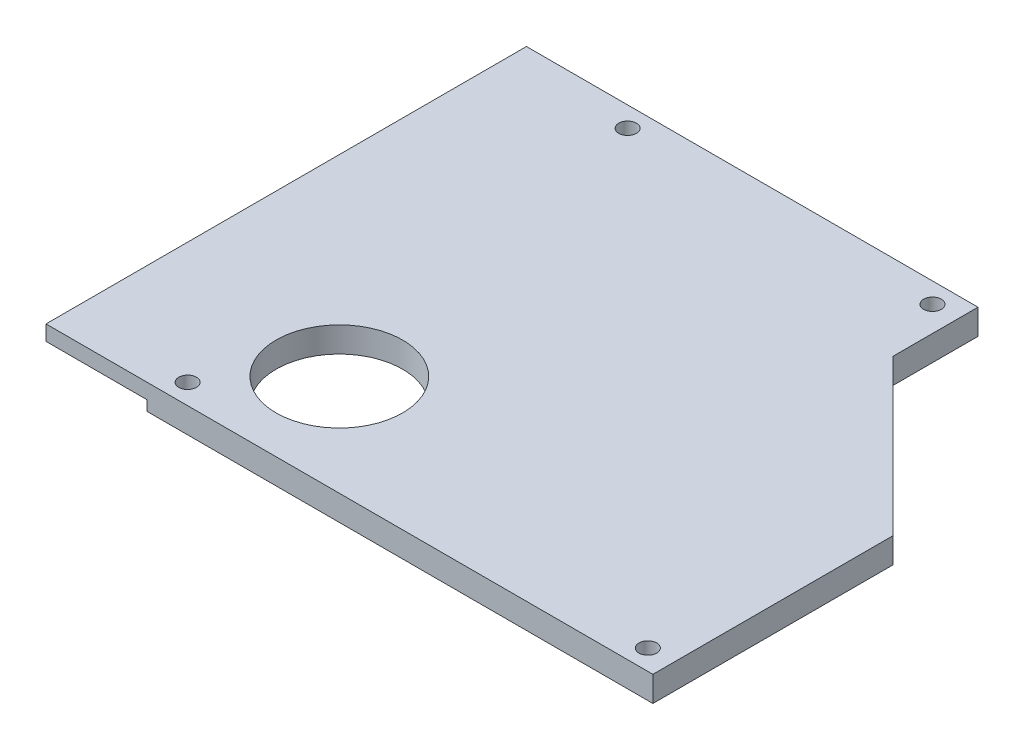
ISO-10303-21;
HEADER;
FILE_DESCRIPTION(('STEP AP214'),'2;1');
FILE_NAME('part.step','',(''),(''),'','','');
FILE_SCHEMA(('AUTOMOTIVE_DESIGN { 1 0 10303 214 1 1 1 1 }'));
ENDSEC;
DATA;
#1=APPLICATION_CONTEXT('core data for automotive mechanical design processes');
#2=APPLICATION_PROTOCOL_DEFINITION('international standard','automotive_design',2000,#1);
#3=PRODUCT_CONTEXT('',#1,'mechanical');
#4=PRODUCT('Part','Part','',(#3));
#5=PRODUCT_RELATED_PRODUCT_CATEGORY('part','',(#4));
#6=PRODUCT_DEFINITION_FORMATION('','',#4);
#7=PRODUCT_DEFINITION_CONTEXT('part definition',#1,'design');
#8=PRODUCT_DEFINITION('design','',#6,#7);
#9=PRODUCT_DEFINITION_SHAPE('','',#8);
#10=(LENGTH_UNIT() NAMED_UNIT(*) SI_UNIT(.MILLI.,.METRE.));
#11=(NAMED_UNIT(*) PLANE_ANGLE_UNIT() SI_UNIT($,.RADIAN.));
#12=(NAMED_UNIT(*) SI_UNIT($,.STERADIAN.) SOLID_ANGLE_UNIT());
#13=UNCERTAINTY_MEASURE_WITH_UNIT(LENGTH_MEASURE(1.E-05),#10,'distance_accuracy_value','');
#14=(GEOMETRIC_REPRESENTATION_CONTEXT(3) GLOBAL_UNCERTAINTY_ASSIGNED_CONTEXT((#13)) GLOBAL_UNIT_ASSIGNED_CONTEXT((#10,
#11,#12)) REPRESENTATION_CONTEXT('',''));
#15=CARTESIAN_POINT('',(0.,0.,0.));
#16=DIRECTION('',(0.,0.,1.));
#17=DIRECTION('',(1.,0.,0.));
#18=AXIS2_PLACEMENT_3D('',#15,#16,#17);
#19=CARTESIAN_POINT('',(-100.,5.,47.5));
#20=DIRECTION('',(0.,0.,-1.));
#21=DIRECTION('',(-1.,0.,0.));
#22=AXIS2_PLACEMENT_3D('',#19,#20,#21);
#23=PLANE('',#22);
#24=DIRECTION('',(0.,-1.,0.));
#25=VECTOR('',#24,1.);
#26=CARTESIAN_POINT('',(0.,15.,47.5));
#27=LINE('',#26,#25);
#28=CARTESIAN_POINT('',(0.,5.,47.5));
#29=VERTEX_POINT('',#28);
#30=CARTESIAN_POINT('',(0.,0.,47.5));
#31=VERTEX_POINT('',#30);
#32=EDGE_CURVE('E171',#29,#31,#27,.T.);
#33=ORIENTED_EDGE('',*,*,#32,.F.);
#34=DIRECTION('',(1.,0.,0.));
#35=VECTOR('',#34,1.);
#36=CARTESIAN_POINT('',(-100.,5.,47.5));
#37=LINE('',#36,#35);
#38=CARTESIAN_POINT('',(-120.,5.,47.5));
#39=VERTEX_POINT('',#38);
#40=EDGE_CURVE('E186',#39,#29,#37,.T.);
#41=ORIENTED_EDGE('',*,*,#40,.F.);
#42=DIRECTION('',(0.,1.,0.));
#43=VECTOR('',#42,1.);
#44=CARTESIAN_POINT('',(-120.,2.,47.5));
#45=LINE('',#44,#43);
#46=CARTESIAN_POINT('',(-120.,2.,47.5));
#47=VERTEX_POINT('',#46);
#48=EDGE_CURVE('E232',#47,#39,#45,.T.);
#49=ORIENTED_EDGE('',*,*,#48,.F.);
#50=DIRECTION('',(1.,0.,0.));
#51=VECTOR('',#50,1.);
#52=CARTESIAN_POINT('',(-100.,2.,47.5));
#53=LINE('',#52,#51);
#54=CARTESIAN_POINT('',(-100.,2.,47.5));
#55=VERTEX_POINT('',#54);
#56=EDGE_CURVE('E230',#47,#55,#53,.T.);
#57=ORIENTED_EDGE('',*,*,#56,.T.);
#58=DIRECTION('',(0.,-1.,0.));
#59=VECTOR('',#58,1.);
#60=CARTESIAN_POINT('',(-100.,5.,47.5));
#61=LINE('',#60,#59);
#62=CARTESIAN_POINT('',(-100.,0.,47.5));
#63=VERTEX_POINT('',#62);
#64=EDGE_CURVE('E192',#55,#63,#61,.T.);
#65=ORIENTED_EDGE('',*,*,#64,.T.);
#66=DIRECTION('',(1.,0.,0.));
#67=VECTOR('',#66,1.);
#68=CARTESIAN_POINT('',(-100.,0.,47.5));
#69=LINE('',#68,#67);
#70=EDGE_CURVE('E187',#63,#31,#69,.T.);
#71=ORIENTED_EDGE('',*,*,#70,.T.);
#72=EDGE_LOOP('',(#33,#41,#49,#57,#65,#71));
#73=FACE_BOUND('',#72,.T.);
#74=ADVANCED_FACE('F69',(#73),#23,.F.);
#75=CARTESIAN_POINT('',(0.,5.,0.));
#76=DIRECTION('',(0.,1.,0.));
#77=DIRECTION('',(0.,0.,1.));
#78=AXIS2_PLACEMENT_3D('',#75,#76,#77);
#79=PLANE('',#78);
#80=DIRECTION('',(0.,0.,1.));
#81=VECTOR('',#80,1.);
#82=CARTESIAN_POINT('',(-30.721825406948,5.,0.));
#83=LINE('',#82,#81);
#84=CARTESIAN_POINT('',(-30.721825406948,5.,-47.5));
#85=VERTEX_POINT('',#84);
#86=CARTESIAN_POINT('',(-30.721825406948,5.,-30.721825406948));
#87=VERTEX_POINT('',#86);
#88=EDGE_CURVE('E163',#85,#87,#83,.T.);
#89=ORIENTED_EDGE('',*,*,#88,.F.);
#90=DIRECTION('',(-1.,0.,0.));
#91=VECTOR('',#90,1.);
#92=CARTESIAN_POINT('',(-100.,5.,-47.5));
#93=LINE('',#92,#91);
#94=CARTESIAN_POINT('',(-120.,5.,-47.5));
#95=VERTEX_POINT('',#94);
#96=EDGE_CURVE('E178',#85,#95,#93,.T.);
#97=ORIENTED_EDGE('',*,*,#96,.T.);
#98=DIRECTION('',(0.,0.,1.));
#99=VECTOR('',#98,1.);
#100=CARTESIAN_POINT('',(-120.,5.,-47.5));
#101=LINE('',#100,#99);
#102=EDGE_CURVE('E220',#95,#39,#101,.T.);
#103=ORIENTED_EDGE('',*,*,#102,.T.);
#104=ORIENTED_EDGE('',*,*,#40,.T.);
#105=DIRECTION('',(0.,0.,-1.));
#106=VECTOR('',#105,1.);
#107=CARTESIAN_POINT('',(0.,5.,0.));
#108=LINE('',#107,#106);
#109=CARTESIAN_POINT('',(0.,5.,0.));
#110=VERTEX_POINT('',#109);
#111=EDGE_CURVE('E85',#29,#110,#108,.T.);
#112=ORIENTED_EDGE('',*,*,#111,.T.);
#113=DIRECTION('',(-0.707106781186548,0.,-0.707106781186548));
#114=VECTOR('',#113,1.);
#115=CARTESIAN_POINT('',(0.,5.,0.));
#116=LINE('',#115,#114);
#117=EDGE_CURVE('E180',#110,#87,#116,.T.);
#118=ORIENTED_EDGE('',*,*,#117,.T.);
#119=EDGE_LOOP('',(#89,#97,#103,#104,#112,#118));
#120=FACE_BOUND('',#119,.T.);
#121=CARTESIAN_POINT('',(-35.721825406948,5.,-43.5));
#122=DIRECTION('',(0.,1.,0.));
#123=DIRECTION('',(0.,0.,1.));
#124=AXIS2_PLACEMENT_3D('',#121,#122,#123);
#125=CIRCLE('',#124,1.75);
#126=CARTESIAN_POINT('',(-35.721825406948,5.,-41.75));
#127=VERTEX_POINT('',#126);
#128=EDGE_CURVE('E217',#127,#127,#125,.T.);
#129=ORIENTED_EDGE('',*,*,#128,.F.);
#130=EDGE_LOOP('',(#129));
#131=FACE_BOUND('',#130,.T.);
#132=CARTESIAN_POINT('',(-4.99999999999999,5.,43.5));
#133=DIRECTION('',(0.,1.,0.));
#134=DIRECTION('',(0.,0.,1.));
#135=AXIS2_PLACEMENT_3D('',#132,#133,#134);
#136=CIRCLE('',#135,1.75);
#137=CARTESIAN_POINT('',(-4.99999999999999,5.,45.25));
#138=VERTEX_POINT('',#137);
#139=EDGE_CURVE('E526',#138,#138,#136,.T.);
#140=ORIENTED_EDGE('',*,*,#139,.F.);
#141=EDGE_LOOP('',(#140));
#142=FACE_BOUND('',#141,.T.);
#143=CARTESIAN_POINT('',(-96.,5.,43.5));
#144=DIRECTION('',(0.,1.,0.));
#145=DIRECTION('',(0.,0.,1.));
#146=AXIS2_PLACEMENT_3D('',#143,#144,#145);
#147=CIRCLE('',#146,1.75);
#148=CARTESIAN_POINT('',(-96.,5.,45.25));
#149=VERTEX_POINT('',#148);
#150=EDGE_CURVE('E290',#149,#149,#147,.T.);
#151=ORIENTED_EDGE('',*,*,#150,.F.);
#152=EDGE_LOOP('',(#151));
#153=FACE_BOUND('',#152,.T.);
#154=CARTESIAN_POINT('',(-96.,5.,-43.5));
#155=DIRECTION('',(0.,1.,0.));
#156=DIRECTION('',(0.,0.,1.));
#157=AXIS2_PLACEMENT_3D('',#154,#155,#156);
#158=CIRCLE('',#157,1.75);
#159=CARTESIAN_POINT('',(-96.,5.,-41.75));
#160=VERTEX_POINT('',#159);
#161=EDGE_CURVE('E204',#160,#160,#158,.T.);
#162=ORIENTED_EDGE('',*,*,#161,.F.);
#163=EDGE_LOOP('',(#162));
#164=FACE_BOUND('',#163,.T.);
#165=CARTESIAN_POINT('',(-82.,5.,27.5));
#166=DIRECTION('',(0.,1.,0.));
#167=DIRECTION('',(0.,0.,1.));
#168=AXIS2_PLACEMENT_3D('',#165,#166,#167);
#169=CIRCLE('',#168,12.5);
#170=CARTESIAN_POINT('',(-82.,5.,40.));
#171=VERTEX_POINT('',#170);
#172=EDGE_CURVE('E281',#171,#171,#169,.T.);
#173=ORIENTED_EDGE('',*,*,#172,.F.);
#174=EDGE_LOOP('',(#173));
#175=FACE_BOUND('',#174,.T.);
#176=ADVANCED_FACE('F175',(#120,#131,#142,#153,#164,#175),#79,.T.);
#177=CARTESIAN_POINT('',(0.,0.,0.));
#178=DIRECTION('',(0.,1.,0.));
#179=DIRECTION('',(0.,0.,1.));
#180=AXIS2_PLACEMENT_3D('',#177,#178,#179);
#181=PLANE('',#180);
#182=CARTESIAN_POINT('',(-35.721825406948,0.,-43.5));
#183=DIRECTION('',(0.,1.,0.));
#184=DIRECTION('',(0.,0.,1.));
#185=AXIS2_PLACEMENT_3D('',#182,#183,#184);
#186=CIRCLE('',#185,1.75);
#187=CARTESIAN_POINT('',(-35.721825406948,0.,-41.75));
#188=VERTEX_POINT('',#187);
#189=EDGE_CURVE('E216',#188,#188,#186,.T.);
#190=ORIENTED_EDGE('',*,*,#189,.T.);
#191=EDGE_LOOP('',(#190));
#192=FACE_BOUND('',#191,.T.);
#193=CARTESIAN_POINT('',(-4.99999999999999,0.,43.5));
#194=DIRECTION('',(0.,1.,0.));
#195=DIRECTION('',(0.,0.,1.));
#196=AXIS2_PLACEMENT_3D('',#193,#194,#195);
#197=CIRCLE('',#196,1.75);
#198=CARTESIAN_POINT('',(-4.99999999999999,0.,45.25));
#199=VERTEX_POINT('',#198);
#200=EDGE_CURVE('E213',#199,#199,#197,.T.);
#201=ORIENTED_EDGE('',*,*,#200,.T.);
#202=EDGE_LOOP('',(#201));
#203=FACE_BOUND('',#202,.T.);
#204=CARTESIAN_POINT('',(-96.,0.,43.5));
#205=DIRECTION('',(0.,1.,0.));
#206=DIRECTION('',(0.,0.,1.));
#207=AXIS2_PLACEMENT_3D('',#204,#205,#206);
#208=CIRCLE('',#207,1.75);
#209=CARTESIAN_POINT('',(-96.,0.,45.25));
#210=VERTEX_POINT('',#209);
#211=EDGE_CURVE('E289',#210,#210,#208,.T.);
#212=ORIENTED_EDGE('',*,*,#211,.T.);
#213=EDGE_LOOP('',(#212));
#214=FACE_BOUND('',#213,.T.);
#215=CARTESIAN_POINT('',(-96.,0.,-43.5));
#216=DIRECTION('',(0.,1.,0.));
#217=DIRECTION('',(0.,0.,1.));
#218=AXIS2_PLACEMENT_3D('',#215,#216,#217);
#219=CIRCLE('',#218,1.75);
#220=CARTESIAN_POINT('',(-96.,0.,-41.75));
#221=VERTEX_POINT('',#220);
#222=EDGE_CURVE('E198',#221,#221,#219,.T.);
#223=ORIENTED_EDGE('',*,*,#222,.T.);
#224=EDGE_LOOP('',(#223));
#225=FACE_BOUND('',#224,.T.);
#226=DIRECTION('',(-1.,0.,0.));
#227=VECTOR('',#226,1.);
#228=CARTESIAN_POINT('',(-100.,0.,-47.5));
#229=LINE('',#228,#227);
#230=CARTESIAN_POINT('',(-30.721825406948,0.,-47.5));
#231=VERTEX_POINT('',#230);
#232=CARTESIAN_POINT('',(-100.,0.,-47.5));
#233=VERTEX_POINT('',#232);
#234=EDGE_CURVE('E201',#231,#233,#229,.T.);
#235=ORIENTED_EDGE('',*,*,#234,.F.);
#236=DIRECTION('',(0.,0.,1.));
#237=VECTOR('',#236,1.);
#238=CARTESIAN_POINT('',(-30.721825406948,0.,0.));
#239=LINE('',#238,#237);
#240=CARTESIAN_POINT('',(-30.721825406948,0.,-30.721825406948));
#241=VERTEX_POINT('',#240);
#242=EDGE_CURVE('E166',#231,#241,#239,.T.);
#243=ORIENTED_EDGE('',*,*,#242,.T.);
#244=DIRECTION('',(-0.707106781186548,0.,-0.707106781186548));
#245=VECTOR('',#244,1.);
#246=CARTESIAN_POINT('',(0.,0.,0.));
#247=LINE('',#246,#245);
#248=CARTESIAN_POINT('',(0.,0.,0.));
#249=VERTEX_POINT('',#248);
#250=EDGE_CURVE('E12',#249,#241,#247,.T.);
#251=ORIENTED_EDGE('',*,*,#250,.F.);
#252=DIRECTION('',(0.,0.,-1.));
#253=VECTOR('',#252,1.);
#254=CARTESIAN_POINT('',(0.,0.,0.));
#255=LINE('',#254,#253);
#256=EDGE_CURVE('E505',#31,#249,#255,.T.);
#257=ORIENTED_EDGE('',*,*,#256,.F.);
#258=ORIENTED_EDGE('',*,*,#70,.F.);
#259=DIRECTION('',(0.,0.,1.));
#260=VECTOR('',#259,1.);
#261=CARTESIAN_POINT('',(-100.,0.,-47.5));
#262=LINE('',#261,#260);
#263=EDGE_CURVE('E195',#233,#63,#262,.T.);
#264=ORIENTED_EDGE('',*,*,#263,.F.);
#265=EDGE_LOOP('',(#235,#243,#251,#257,#258,#264));
#266=FACE_BOUND('',#265,.T.);
#267=CARTESIAN_POINT('',(-82.,0.,27.5));
#268=DIRECTION('',(0.,1.,0.));
#269=DIRECTION('',(0.,0.,1.));
#270=AXIS2_PLACEMENT_3D('',#267,#268,#269);
#271=CIRCLE('',#270,12.5);
#272=CARTESIAN_POINT('',(-82.,0.,40.));
#273=VERTEX_POINT('',#272);
#274=EDGE_CURVE('E285',#273,#273,#271,.F.);
#275=ORIENTED_EDGE('',*,*,#274,.F.);
#276=EDGE_LOOP('',(#275));
#277=FACE_BOUND('',#276,.T.);
#278=DIRECTION('',(0.,0.,-1.));
#279=VECTOR('',#278,1.);
#280=CARTESIAN_POINT('',(-90.5,0.,0.));
#281=LINE('',#280,#279);
#282=CARTESIAN_POINT('',(-90.5,0.,-0.999999999999996));
#283=VERTEX_POINT('',#282);
#284=CARTESIAN_POINT('',(-90.5,0.,-38.));
#285=VERTEX_POINT('',#284);
#286=EDGE_CURVE('E243',#283,#285,#281,.T.);
#287=ORIENTED_EDGE('',*,*,#286,.F.);
#288=DIRECTION('',(1.,0.,0.));
#289=VECTOR('',#288,1.);
#290=CARTESIAN_POINT('',(0.,0.,-0.999999999999996));
#291=LINE('',#290,#289);
#292=CARTESIAN_POINT('',(-74.5,0.,-0.999999999999996));
#293=VERTEX_POINT('',#292);
#294=EDGE_CURVE('E236',#283,#293,#291,.T.);
#295=ORIENTED_EDGE('',*,*,#294,.T.);
#296=DIRECTION('',(0.,0.,-1.));
#297=VECTOR('',#296,1.);
#298=CARTESIAN_POINT('',(-74.5,0.,0.));
#299=LINE('',#298,#297);
#300=CARTESIAN_POINT('',(-74.5,0.,-38.));
#301=VERTEX_POINT('',#300);
#302=EDGE_CURVE('E258',#293,#301,#299,.T.);
#303=ORIENTED_EDGE('',*,*,#302,.T.);
#304=DIRECTION('',(1.,0.,0.));
#305=VECTOR('',#304,1.);
#306=CARTESIAN_POINT('',(0.,0.,-38.));
#307=LINE('',#306,#305);
#308=EDGE_CURVE('E262',#285,#301,#307,.T.);
#309=ORIENTED_EDGE('',*,*,#308,.F.);
#310=EDGE_LOOP('',(#287,#295,#303,#309));
#311=FACE_BOUND('',#310,.T.);
#312=ADVANCED_FACE('F304',(#192,#203,#214,#225,#266,#277,#311),#181,.F.);
#313=CARTESIAN_POINT('',(-100.,5.,-47.5));
#314=DIRECTION('',(0.,0.,1.));
#315=DIRECTION('',(1.,0.,0.));
#316=AXIS2_PLACEMENT_3D('',#313,#314,#315);
#317=PLANE('',#316);
#318=ORIENTED_EDGE('',*,*,#96,.F.);
#319=DIRECTION('',(0.,-1.,0.));
#320=VECTOR('',#319,1.);
#321=CARTESIAN_POINT('',(-30.721825406948,15.,-47.5));
#322=LINE('',#321,#320);
#323=EDGE_CURVE('E159',#85,#231,#322,.T.);
#324=ORIENTED_EDGE('',*,*,#323,.T.);
#325=ORIENTED_EDGE('',*,*,#234,.T.);
#326=DIRECTION('',(0.,-1.,0.));
#327=VECTOR('',#326,1.);
#328=CARTESIAN_POINT('',(-100.,5.,-47.5));
#329=LINE('',#328,#327);
#330=CARTESIAN_POINT('',(-100.,2.,-47.5));
#331=VERTEX_POINT('',#330);
#332=EDGE_CURVE('E78',#331,#233,#329,.T.);
#333=ORIENTED_EDGE('',*,*,#332,.F.);
#334=DIRECTION('',(-1.,0.,0.));
#335=VECTOR('',#334,1.);
#336=CARTESIAN_POINT('',(-100.,2.,-47.5));
#337=LINE('',#336,#335);
#338=CARTESIAN_POINT('',(-120.,2.,-47.5));
#339=VERTEX_POINT('',#338);
#340=EDGE_CURVE('E93',#331,#339,#337,.T.);
#341=ORIENTED_EDGE('',*,*,#340,.T.);
#342=DIRECTION('',(0.,1.,0.));
#343=VECTOR('',#342,1.);
#344=CARTESIAN_POINT('',(-120.,2.,-47.5));
#345=LINE('',#344,#343);
#346=EDGE_CURVE('E183',#339,#95,#345,.T.);
#347=ORIENTED_EDGE('',*,*,#346,.T.);
#348=EDGE_LOOP('',(#318,#324,#325,#333,#341,#347));
#349=FACE_BOUND('',#348,.T.);
#350=ADVANCED_FACE('F71',(#349),#317,.F.);
#351=CARTESIAN_POINT('',(-100.,5.,-47.5));
#352=DIRECTION('',(1.,0.,0.));
#353=DIRECTION('',(0.,0.,-1.));
#354=AXIS2_PLACEMENT_3D('',#351,#352,#353);
#355=PLANE('',#354);
#356=ORIENTED_EDGE('',*,*,#64,.F.);
#357=DIRECTION('',(0.,0.,-1.));
#358=VECTOR('',#357,1.);
#359=CARTESIAN_POINT('',(-100.,2.,-47.5));
#360=LINE('',#359,#358);
#361=EDGE_CURVE('E224',#55,#331,#360,.T.);
#362=ORIENTED_EDGE('',*,*,#361,.T.);
#363=ORIENTED_EDGE('',*,*,#332,.T.);
#364=ORIENTED_EDGE('',*,*,#263,.T.);
#365=EDGE_LOOP('',(#356,#362,#363,#364));
#366=FACE_BOUND('',#365,.T.);
#367=ADVANCED_FACE('F310',(#366),#355,.F.);
#368=CARTESIAN_POINT('',(-96.,5.,-43.5));
#369=DIRECTION('',(0.,-1.,0.));
#370=DIRECTION('',(0.,0.,-1.));
#371=AXIS2_PLACEMENT_3D('',#368,#369,#370);
#372=CYLINDRICAL_SURFACE('',#371,1.75);
#373=ORIENTED_EDGE('',*,*,#161,.T.);
#374=EDGE_LOOP('',(#373));
#375=FACE_BOUND('',#374,.T.);
#376=ORIENTED_EDGE('',*,*,#222,.F.);
#377=EDGE_LOOP('',(#376));
#378=FACE_BOUND('',#377,.T.);
#379=ADVANCED_FACE('F307',(#375,#378),#372,.F.);
#380=CARTESIAN_POINT('',(-96.,5.,43.5));
#381=DIRECTION('',(0.,-1.,0.));
#382=DIRECTION('',(0.,0.,-1.));
#383=AXIS2_PLACEMENT_3D('',#380,#381,#382);
#384=CYLINDRICAL_SURFACE('',#383,1.75);
#385=ORIENTED_EDGE('',*,*,#150,.T.);
#386=EDGE_LOOP('',(#385));
#387=FACE_BOUND('',#386,.T.);
#388=ORIENTED_EDGE('',*,*,#211,.F.);
#389=EDGE_LOOP('',(#388));
#390=FACE_BOUND('',#389,.T.);
#391=ADVANCED_FACE('F309',(#387,#390),#384,.F.);
#392=CARTESIAN_POINT('',(-82.,-111.722871427474,27.5));
#393=DIRECTION('',(0.,1.,0.));
#394=DIRECTION('',(0.,0.,1.));
#395=AXIS2_PLACEMENT_3D('',#392,#393,#394);
#396=CYLINDRICAL_SURFACE('',#395,12.5);
#397=ORIENTED_EDGE('',*,*,#274,.T.);
#398=EDGE_LOOP('',(#397));
#399=FACE_BOUND('',#398,.T.);
#400=ORIENTED_EDGE('',*,*,#172,.T.);
#401=EDGE_LOOP('',(#400));
#402=FACE_BOUND('',#401,.T.);
#403=ADVANCED_FACE('F315',(#399,#402),#396,.F.);
#404=CARTESIAN_POINT('',(-90.5,-4.2,0.));
#405=DIRECTION('',(1.,0.,0.));
#406=DIRECTION('',(0.,0.,-1.));
#407=AXIS2_PLACEMENT_3D('',#404,#405,#406);
#408=PLANE('',#407);
#409=ORIENTED_EDGE('',*,*,#286,.T.);
#410=DIRECTION('',(0.,1.,0.));
#411=VECTOR('',#410,1.);
#412=CARTESIAN_POINT('',(-90.5,-4.2,-38.));
#413=LINE('',#412,#411);
#414=CARTESIAN_POINT('',(-90.5,-4.2,-38.));
#415=VERTEX_POINT('',#414);
#416=EDGE_CURVE('E272',#415,#285,#413,.T.);
#417=ORIENTED_EDGE('',*,*,#416,.F.);
#418=DIRECTION('',(0.,0.,-1.));
#419=VECTOR('',#418,1.);
#420=CARTESIAN_POINT('',(-90.5,-4.2,0.));
#421=LINE('',#420,#419);
#422=CARTESIAN_POINT('',(-90.5,-4.2,-0.999999999999996));
#423=VERTEX_POINT('',#422);
#424=EDGE_CURVE('E250',#423,#415,#421,.T.);
#425=ORIENTED_EDGE('',*,*,#424,.F.);
#426=DIRECTION('',(0.,1.,0.));
#427=VECTOR('',#426,1.);
#428=CARTESIAN_POINT('',(-90.5,-4.2,-0.999999999999996));
#429=LINE('',#428,#427);
#430=EDGE_CURVE('E254',#423,#283,#429,.T.);
#431=ORIENTED_EDGE('',*,*,#430,.T.);
#432=EDGE_LOOP('',(#409,#417,#425,#431));
#433=FACE_BOUND('',#432,.T.);
#434=ADVANCED_FACE('F360',(#433),#408,.F.);
#435=CARTESIAN_POINT('',(0.,-4.2,-38.));
#436=DIRECTION('',(0.,0.,1.));
#437=DIRECTION('',(1.,0.,0.));
#438=AXIS2_PLACEMENT_3D('',#435,#436,#437);
#439=PLANE('',#438);
#440=ORIENTED_EDGE('',*,*,#308,.T.);
#441=DIRECTION('',(0.,1.,0.));
#442=VECTOR('',#441,1.);
#443=CARTESIAN_POINT('',(-74.5,-4.2,-38.));
#444=LINE('',#443,#442);
#445=CARTESIAN_POINT('',(-74.5,-4.2,-38.));
#446=VERTEX_POINT('',#445);
#447=EDGE_CURVE('E275',#446,#301,#444,.T.);
#448=ORIENTED_EDGE('',*,*,#447,.F.);
#449=DIRECTION('',(1.,0.,0.));
#450=VECTOR('',#449,1.);
#451=CARTESIAN_POINT('',(0.,-4.2,-38.));
#452=LINE('',#451,#450);
#453=EDGE_CURVE('E246',#415,#446,#452,.T.);
#454=ORIENTED_EDGE('',*,*,#453,.F.);
#455=ORIENTED_EDGE('',*,*,#416,.T.);
#456=EDGE_LOOP('',(#440,#448,#454,#455));
#457=FACE_BOUND('',#456,.T.);
#458=ADVANCED_FACE('F363',(#457),#439,.F.);
#459=CARTESIAN_POINT('',(-74.5,-4.2,0.));
#460=DIRECTION('',(1.,0.,0.));
#461=DIRECTION('',(0.,0.,-1.));
#462=AXIS2_PLACEMENT_3D('',#459,#460,#461);
#463=PLANE('',#462);
#464=ORIENTED_EDGE('',*,*,#302,.F.);
#465=DIRECTION('',(0.,1.,0.));
#466=VECTOR('',#465,1.);
#467=CARTESIAN_POINT('',(-74.5,-4.2,-0.999999999999996));
#468=LINE('',#467,#466);
#469=CARTESIAN_POINT('',(-74.5,-4.2,-0.999999999999996));
#470=VERTEX_POINT('',#469);
#471=EDGE_CURVE('E278',#470,#293,#468,.T.);
#472=ORIENTED_EDGE('',*,*,#471,.F.);
#473=DIRECTION('',(0.,0.,-1.));
#474=VECTOR('',#473,1.);
#475=CARTESIAN_POINT('',(-74.5,-4.2,0.));
#476=LINE('',#475,#474);
#477=EDGE_CURVE('E242',#470,#446,#476,.T.);
#478=ORIENTED_EDGE('',*,*,#477,.T.);
#479=ORIENTED_EDGE('',*,*,#447,.T.);
#480=EDGE_LOOP('',(#464,#472,#478,#479));
#481=FACE_BOUND('',#480,.T.);
#482=ADVANCED_FACE('F367',(#481),#463,.T.);
#483=CARTESIAN_POINT('',(0.,-4.2,-0.999999999999996));
#484=DIRECTION('',(0.,0.,1.));
#485=DIRECTION('',(1.,0.,0.));
#486=AXIS2_PLACEMENT_3D('',#483,#484,#485);
#487=PLANE('',#486);
#488=ORIENTED_EDGE('',*,*,#294,.F.);
#489=ORIENTED_EDGE('',*,*,#430,.F.);
#490=DIRECTION('',(1.,0.,0.));
#491=VECTOR('',#490,1.);
#492=CARTESIAN_POINT('',(0.,-4.2,-0.999999999999996));
#493=LINE('',#492,#491);
#494=EDGE_CURVE('E239',#423,#470,#493,.T.);
#495=ORIENTED_EDGE('',*,*,#494,.T.);
#496=ORIENTED_EDGE('',*,*,#471,.T.);
#497=EDGE_LOOP('',(#488,#489,#495,#496));
#498=FACE_BOUND('',#497,.T.);
#499=ADVANCED_FACE('F371',(#498),#487,.T.);
#500=CARTESIAN_POINT('',(0.,-4.2,0.));
#501=DIRECTION('',(0.,1.,0.));
#502=DIRECTION('',(0.,0.,1.));
#503=AXIS2_PLACEMENT_3D('',#500,#501,#502);
#504=PLANE('',#503);
#505=ORIENTED_EDGE('',*,*,#494,.F.);
#506=ORIENTED_EDGE('',*,*,#424,.T.);
#507=ORIENTED_EDGE('',*,*,#453,.T.);
#508=ORIENTED_EDGE('',*,*,#477,.F.);
#509=EDGE_LOOP('',(#505,#506,#507,#508));
#510=FACE_BOUND('',#509,.T.);
#511=ADVANCED_FACE('F358',(#510),#504,.F.);
#512=CARTESIAN_POINT('',(-120.,2.,-47.5));
#513=DIRECTION('',(-1.,0.,0.));
#514=DIRECTION('',(0.,0.,1.));
#515=AXIS2_PLACEMENT_3D('',#512,#513,#514);
#516=PLANE('',#515);
#517=ORIENTED_EDGE('',*,*,#102,.F.);
#518=ORIENTED_EDGE('',*,*,#346,.F.);
#519=DIRECTION('',(0.,0.,1.));
#520=VECTOR('',#519,1.);
#521=CARTESIAN_POINT('',(-120.,2.,-47.5));
#522=LINE('',#521,#520);
#523=EDGE_CURVE('E521',#339,#47,#522,.T.);
#524=ORIENTED_EDGE('',*,*,#523,.T.);
#525=ORIENTED_EDGE('',*,*,#48,.T.);
#526=EDGE_LOOP('',(#517,#518,#524,#525));
#527=FACE_BOUND('',#526,.T.);
#528=ADVANCED_FACE('F351',(#527),#516,.T.);
#529=CARTESIAN_POINT('',(0.,2.,0.));
#530=DIRECTION('',(0.,-1.,0.));
#531=DIRECTION('',(0.,0.,-1.));
#532=AXIS2_PLACEMENT_3D('',#529,#530,#531);
#533=PLANE('',#532);
#534=ORIENTED_EDGE('',*,*,#361,.F.);
#535=ORIENTED_EDGE('',*,*,#56,.F.);
#536=ORIENTED_EDGE('',*,*,#523,.F.);
#537=ORIENTED_EDGE('',*,*,#340,.F.);
#538=EDGE_LOOP('',(#534,#535,#536,#537));
#539=FACE_BOUND('',#538,.T.);
#540=ADVANCED_FACE('F342',(#539),#533,.T.);
#541=CARTESIAN_POINT('',(-4.99999999999999,-5.,43.5));
#542=DIRECTION('',(0.,1.,0.));
#543=DIRECTION('',(0.,0.,1.));
#544=AXIS2_PLACEMENT_3D('',#541,#542,#543);
#545=CYLINDRICAL_SURFACE('',#544,1.75);
#546=ORIENTED_EDGE('',*,*,#139,.T.);
#547=EDGE_LOOP('',(#546));
#548=FACE_BOUND('',#547,.T.);
#549=ORIENTED_EDGE('',*,*,#200,.F.);
#550=EDGE_LOOP('',(#549));
#551=FACE_BOUND('',#550,.T.);
#552=ADVANCED_FACE('F339',(#548,#551),#545,.F.);
#553=CARTESIAN_POINT('',(-35.721825406948,-5.,-43.5));
#554=DIRECTION('',(0.,1.,0.));
#555=DIRECTION('',(0.,0.,1.));
#556=AXIS2_PLACEMENT_3D('',#553,#554,#555);
#557=CYLINDRICAL_SURFACE('',#556,1.75);
#558=ORIENTED_EDGE('',*,*,#128,.T.);
#559=EDGE_LOOP('',(#558));
#560=FACE_BOUND('',#559,.T.);
#561=ORIENTED_EDGE('',*,*,#189,.F.);
#562=EDGE_LOOP('',(#561));
#563=FACE_BOUND('',#562,.T.);
#564=ADVANCED_FACE('F341',(#560,#563),#557,.F.);
#565=CARTESIAN_POINT('',(0.,15.,0.));
#566=DIRECTION('',(0.707106781186548,0.,-0.707106781186548));
#567=DIRECTION('',(-0.707106781186548,0.,-0.707106781186548));
#568=AXIS2_PLACEMENT_3D('',#565,#566,#567);
#569=PLANE('',#568);
#570=DIRECTION('',(0.,-1.,0.));
#571=VECTOR('',#570,1.);
#572=CARTESIAN_POINT('',(0.,15.,0.));
#573=LINE('',#572,#571);
#574=EDGE_CURVE('E508',#110,#249,#573,.T.);
#575=ORIENTED_EDGE('',*,*,#574,.T.);
#576=ORIENTED_EDGE('',*,*,#250,.T.);
#577=DIRECTION('',(0.,-1.,0.));
#578=VECTOR('',#577,1.);
#579=CARTESIAN_POINT('',(-30.721825406948,15.,-30.721825406948));
#580=LINE('',#579,#578);
#581=EDGE_CURVE('E514',#87,#241,#580,.T.);
#582=ORIENTED_EDGE('',*,*,#581,.F.);
#583=ORIENTED_EDGE('',*,*,#117,.F.);
#584=EDGE_LOOP('',(#575,#576,#582,#583));
#585=FACE_BOUND('',#584,.T.);
#586=ADVANCED_FACE('F348',(#585),#569,.T.);
#587=CARTESIAN_POINT('',(-30.721825406948,15.,0.));
#588=DIRECTION('',(-1.,0.,0.));
#589=DIRECTION('',(0.,0.,1.));
#590=AXIS2_PLACEMENT_3D('',#587,#588,#589);
#591=PLANE('',#590);
#592=ORIENTED_EDGE('',*,*,#88,.T.);
#593=ORIENTED_EDGE('',*,*,#581,.T.);
#594=ORIENTED_EDGE('',*,*,#242,.F.);
#595=ORIENTED_EDGE('',*,*,#323,.F.);
#596=EDGE_LOOP('',(#592,#593,#594,#595));
#597=FACE_BOUND('',#596,.T.);
#598=ADVANCED_FACE('F161',(#597),#591,.F.);
#599=CARTESIAN_POINT('',(0.,15.,0.));
#600=DIRECTION('',(1.,0.,0.));
#601=DIRECTION('',(0.,0.,-1.));
#602=AXIS2_PLACEMENT_3D('',#599,#600,#601);
#603=PLANE('',#602);
#604=ORIENTED_EDGE('',*,*,#32,.T.);
#605=ORIENTED_EDGE('',*,*,#256,.T.);
#606=ORIENTED_EDGE('',*,*,#574,.F.);
#607=ORIENTED_EDGE('',*,*,#111,.F.);
#608=EDGE_LOOP('',(#604,#605,#606,#607));
#609=FACE_BOUND('',#608,.T.);
#610=ADVANCED_FACE('F494',(#609),#603,.T.);
#611=CLOSED_SHELL('',(#74,#176,#312,#350,#367,#379,#391,#403,#434,#458,#482,#499,#511,#528,#540,
#552,#564,#586,#598,#610));
#612=MANIFOLD_SOLID_BREP('B2',#611);
#613=ADVANCED_BREP_SHAPE_REPRESENTATION('',(#18,#612),#14);
#614=SHAPE_DEFINITION_REPRESENTATION(#9,#613);
ENDSEC;
END-ISO-10303-21;
